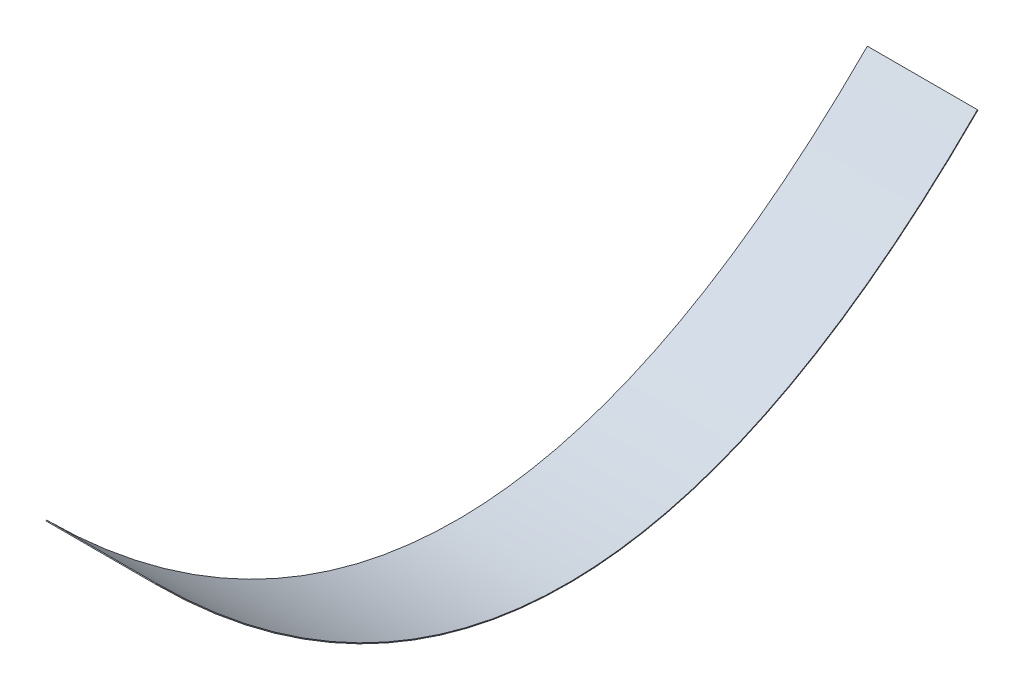
ISO-10303-21;
HEADER;
FILE_DESCRIPTION(('STEP AP214'),'2;1');
FILE_NAME('part.step','',(''),(''),'','','');
FILE_SCHEMA(('AUTOMOTIVE_DESIGN { 1 0 10303 214 1 1 1 1 }'));
ENDSEC;
DATA;
#1=APPLICATION_CONTEXT('core data for automotive mechanical design processes');
#2=APPLICATION_PROTOCOL_DEFINITION('international standard','automotive_design',2000,#1);
#3=PRODUCT_CONTEXT('',#1,'mechanical');
#4=PRODUCT('Part','Part','',(#3));
#5=PRODUCT_RELATED_PRODUCT_CATEGORY('part','',(#4));
#6=PRODUCT_DEFINITION_FORMATION('','',#4);
#7=PRODUCT_DEFINITION_CONTEXT('part definition',#1,'design');
#8=PRODUCT_DEFINITION('design','',#6,#7);
#9=PRODUCT_DEFINITION_SHAPE('','',#8);
#10=(LENGTH_UNIT() NAMED_UNIT(*) SI_UNIT(.MILLI.,.METRE.));
#11=(NAMED_UNIT(*) PLANE_ANGLE_UNIT() SI_UNIT($,.RADIAN.));
#12=(NAMED_UNIT(*) SI_UNIT($,.STERADIAN.) SOLID_ANGLE_UNIT());
#13=UNCERTAINTY_MEASURE_WITH_UNIT(LENGTH_MEASURE(1.E-05),#10,'distance_accuracy_value','');
#14=(GEOMETRIC_REPRESENTATION_CONTEXT(3) GLOBAL_UNCERTAINTY_ASSIGNED_CONTEXT((#13)) GLOBAL_UNIT_ASSIGNED_CONTEXT((#10,
#11,#12)) REPRESENTATION_CONTEXT('',''));
#15=CARTESIAN_POINT('',(0.,0.,0.));
#16=DIRECTION('',(0.,0.,1.));
#17=DIRECTION('',(1.,0.,0.));
#18=AXIS2_PLACEMENT_3D('',#15,#16,#17);
#19=CARTESIAN_POINT('',(355.6,586.847130222272,-1325.35391397918));
#20=CARTESIAN_POINT('',(355.6,476.326132373149,-1214.83291806103));
#21=CARTESIAN_POINT('',(355.6,379.634611527581,-1104.32592885717));
#22=CARTESIAN_POINT('',(355.6,213.903421546227,-883.351011787333));
#23=CARTESIAN_POINT('',(355.6,144.863862614837,-772.883427474339));
#24=CARTESIAN_POINT('',(355.6,34.4194856223334,-551.994675448119));
#25=CARTESIAN_POINT('',(355.6,-6.98568006476537,-441.574000959311));
#26=CARTESIAN_POINT('',(355.6,-62.1869629428457,-220.768870498862));
#27=CARTESIAN_POINT('',(355.6,-75.9839209717906,-110.384143639576));
#28=CARTESIAN_POINT('',(355.6,-75.9839210009218,110.384189664636));
#29=CARTESIAN_POINT('',(355.6,-62.186963001041,220.76891700895));
#30=CARTESIAN_POINT('',(355.6,-6.98568017886781,441.57404940776));
#31=CARTESIAN_POINT('',(355.6,34.4194854813689,551.994725349752));
#32=CARTESIAN_POINT('',(355.6,144.863862421881,772.883481247837));
#33=CARTESIAN_POINT('',(355.6,213.903421328107,883.351067979498));
#34=CARTESIAN_POINT('',(355.6,379.634611259261,1104.3259908513));
#35=CARTESIAN_POINT('',(355.6,476.326132079796,1214.83298343851));
#36=CARTESIAN_POINT('',(355.6,586.847129903645,1325.35398322249));
#37=B_SPLINE_CURVE_WITH_KNOTS('',3,(#19,#20,#21,#22,#23,#24,#25,#26,#27,#28,#29,#30,#31,#32,#33,
#34,#35,#36),.UNSPECIFIED.,.F.,.F.,(4,2,2,2,2,2,2,2,4),(0.,0.125,0.25,0.375,0.5,0.625,0.75,
0.875,1.),.UNSPECIFIED.);
#38=DIRECTION('',(-1.,0.,0.));
#39=VECTOR('',#38,1.);
#40=SURFACE_OF_LINEAR_EXTRUSION('',#37,#39);
#41=CARTESIAN_POINT('',(0.,586.847130222272,-1325.35391397918));
#42=CARTESIAN_POINT('',(0.,476.326132373149,-1214.83291806103));
#43=CARTESIAN_POINT('',(0.,379.634611527581,-1104.32592885717));
#44=CARTESIAN_POINT('',(0.,213.903421546227,-883.351011787333));
#45=CARTESIAN_POINT('',(0.,144.863862614837,-772.883427474339));
#46=CARTESIAN_POINT('',(0.,34.4194856223334,-551.994675448119));
#47=CARTESIAN_POINT('',(0.,-6.98568006476537,-441.574000959311));
#48=CARTESIAN_POINT('',(0.,-62.1869629428457,-220.768870498862));
#49=CARTESIAN_POINT('',(0.,-75.9839209717906,-110.384143639576));
#50=CARTESIAN_POINT('',(0.,-75.9839210009218,110.384189664636));
#51=CARTESIAN_POINT('',(0.,-62.186963001041,220.76891700895));
#52=CARTESIAN_POINT('',(0.,-6.98568017886781,441.57404940776));
#53=CARTESIAN_POINT('',(0.,34.4194854813689,551.994725349752));
#54=CARTESIAN_POINT('',(0.,144.863862421881,772.883481247837));
#55=CARTESIAN_POINT('',(0.,213.903421328107,883.351067979498));
#56=CARTESIAN_POINT('',(0.,379.634611259261,1104.3259908513));
#57=CARTESIAN_POINT('',(0.,476.326132079796,1214.83298343851));
#58=CARTESIAN_POINT('',(0.,586.847129903645,1325.35398322249));
#59=B_SPLINE_CURVE_WITH_KNOTS('',3,(#41,#42,#43,#44,#45,#46,#47,#48,#49,#50,#51,#52,#53,#54,#55,
#56,#57,#58),.UNSPECIFIED.,.F.,.F.,(4,2,2,2,2,2,2,2,4),(0.,0.125,0.25,0.375,0.5,0.625,0.75,
0.875,1.),.UNSPECIFIED.);
#60=CARTESIAN_POINT('',(0.,586.847130222272,-1325.35391397918));
#61=VERTEX_POINT('',#60);
#62=CARTESIAN_POINT('',(0.,586.847129903645,1325.35398322249));
#63=VERTEX_POINT('',#62);
#64=EDGE_CURVE('E112',#61,#63,#59,.T.);
#65=ORIENTED_EDGE('',*,*,#64,.T.);
#66=DIRECTION('',(-1.,0.,0.));
#67=VECTOR('',#66,1.);
#68=CARTESIAN_POINT('',(355.6,586.847129903645,1325.35398322249));
#69=LINE('',#68,#67);
#70=CARTESIAN_POINT('',(355.6,586.847129903645,1325.35398322249));
#71=VERTEX_POINT('',#70);
#72=EDGE_CURVE('E11',#71,#63,#69,.T.);
#73=ORIENTED_EDGE('',*,*,#72,.F.);
#74=CARTESIAN_POINT('',(355.6,586.847130222272,-1325.35391397918));
#75=VERTEX_POINT('',#74);
#76=EDGE_CURVE('E73',#75,#71,#37,.T.);
#77=ORIENTED_EDGE('',*,*,#76,.F.);
#78=DIRECTION('',(-1.,0.,0.));
#79=VECTOR('',#78,1.);
#80=CARTESIAN_POINT('',(355.6,586.847130222272,-1325.35391397918));
#81=LINE('',#80,#79);
#82=EDGE_CURVE('E49',#75,#61,#81,.T.);
#83=ORIENTED_EDGE('',*,*,#82,.T.);
#84=EDGE_LOOP('',(#65,#73,#77,#83));
#85=FACE_BOUND('',#84,.T.);
#86=ADVANCED_FACE('F32',(#85),#40,.F.);
#87=CARTESIAN_POINT('',(355.6,585.051078663481,1327.15003443081));
#88=DIRECTION('',(0.,0.707106774918268,0.707106787454827));
#89=DIRECTION('',(0.,-0.707106787454827,0.707106774918268));
#90=AXIS2_PLACEMENT_3D('',#87,#88,#89);
#91=PLANE('',#90);
#92=DIRECTION('',(0.,0.707106787454827,-0.707106774918268));
#93=VECTOR('',#92,1.);
#94=CARTESIAN_POINT('',(0.,585.051078663481,1327.15003443081));
#95=LINE('',#94,#93);
#96=CARTESIAN_POINT('',(0.,585.051078663481,1327.15003443081));
#97=VERTEX_POINT('',#96);
#98=EDGE_CURVE('E82',#97,#63,#95,.T.);
#99=ORIENTED_EDGE('',*,*,#98,.F.);
#100=DIRECTION('',(-1.,0.,0.));
#101=VECTOR('',#100,1.);
#102=CARTESIAN_POINT('',(355.6,585.051078663481,1327.15003443081));
#103=LINE('',#102,#101);
#104=CARTESIAN_POINT('',(355.6,585.051078663481,1327.15003443081));
#105=VERTEX_POINT('',#104);
#106=EDGE_CURVE('E41',#105,#97,#103,.T.);
#107=ORIENTED_EDGE('',*,*,#106,.F.);
#108=DIRECTION('',(0.,0.707106787454827,-0.707106774918268));
#109=VECTOR('',#108,1.);
#110=CARTESIAN_POINT('',(355.6,585.051078663481,1327.15003443081));
#111=LINE('',#110,#109);
#112=EDGE_CURVE('E80',#105,#71,#111,.T.);
#113=ORIENTED_EDGE('',*,*,#112,.T.);
#114=ORIENTED_EDGE('',*,*,#72,.T.);
#115=EDGE_LOOP('',(#99,#107,#113,#114));
#116=FACE_BOUND('',#115,.T.);
#117=ADVANCED_FACE('F79',(#116),#91,.T.);
#118=CARTESIAN_POINT('',(355.6,999921.476979144,-51519.8815967177));
#119=CARTESIAN_POINT('',(355.6,-1000078.52392099,-0.0174715061689312));
#120=CARTESIAN_POINT('',(355.6,999921.475178883,51519.91653973));
#121=B_SPLINE_CURVE_WITH_KNOTS('',2,(#118,#119,#120),.UNSPECIFIED.,.F.,.F.,(3,3),(0.,1.),.UNSPECIFIED.);
#122=DIRECTION('',(-1.,0.,0.));
#123=VECTOR('',#122,1.);
#124=SURFACE_OF_LINEAR_EXTRUSION('',#121,#123);
#125=CARTESIAN_POINT('',(0.,999921.476979144,-51519.8815967177));
#126=CARTESIAN_POINT('',(0.,-1000078.52392099,-0.0174715061689312));
#127=CARTESIAN_POINT('',(0.,999921.475178883,51519.91653973));
#128=B_SPLINE_CURVE_WITH_KNOTS('',2,(#125,#126,#127),.UNSPECIFIED.,.F.,.F.,(3,3),(0.,1.),.UNSPECIFIED.);
#129=CARTESIAN_POINT('',(0.,585.051079013738,-1327.14996521907));
#130=VERTEX_POINT('',#129);
#131=EDGE_CURVE('E116',#130,#97,#128,.T.);
#132=ORIENTED_EDGE('',*,*,#131,.F.);
#133=DIRECTION('',(-1.,0.,0.));
#134=VECTOR('',#133,1.);
#135=CARTESIAN_POINT('',(355.6,585.051079013738,-1327.14996521907));
#136=LINE('',#135,#134);
#137=CARTESIAN_POINT('',(355.6,585.051079013738,-1327.14996521907));
#138=VERTEX_POINT('',#137);
#139=EDGE_CURVE('E62',#138,#130,#136,.T.);
#140=ORIENTED_EDGE('',*,*,#139,.F.);
#141=EDGE_CURVE('E88',#138,#105,#121,.T.);
#142=ORIENTED_EDGE('',*,*,#141,.T.);
#143=ORIENTED_EDGE('',*,*,#106,.T.);
#144=EDGE_LOOP('',(#132,#140,#142,#143));
#145=FACE_BOUND('',#144,.T.);
#146=ADVANCED_FACE('F90',(#145),#124,.T.);
#147=CARTESIAN_POINT('',(355.6,586.847130222272,-1325.35391397918));
#148=DIRECTION('',(0.,0.707106787359497,-0.707106775013598));
#149=DIRECTION('',(0.,0.707106775013598,0.707106787359497));
#150=AXIS2_PLACEMENT_3D('',#147,#148,#149);
#151=PLANE('',#150);
#152=DIRECTION('',(0.,-0.707106775013598,-0.707106787359497));
#153=VECTOR('',#152,1.);
#154=CARTESIAN_POINT('',(0.,586.847130222272,-1325.35391397918));
#155=LINE('',#154,#153);
#156=EDGE_CURVE('E118',#61,#130,#155,.T.);
#157=ORIENTED_EDGE('',*,*,#156,.F.);
#158=ORIENTED_EDGE('',*,*,#82,.F.);
#159=DIRECTION('',(0.,-0.707106775013598,-0.707106787359497));
#160=VECTOR('',#159,1.);
#161=CARTESIAN_POINT('',(355.6,586.847130222272,-1325.35391397918));
#162=LINE('',#161,#160);
#163=EDGE_CURVE('E91',#75,#138,#162,.T.);
#164=ORIENTED_EDGE('',*,*,#163,.T.);
#165=ORIENTED_EDGE('',*,*,#139,.T.);
#166=EDGE_LOOP('',(#157,#158,#164,#165));
#167=FACE_BOUND('',#166,.T.);
#168=ADVANCED_FACE('F104',(#167),#151,.T.);
#169=CARTESIAN_POINT('',(355.6,-75.9839209863562,2.30125301948296E-05));
#170=DIRECTION('',(1.,0.,0.));
#171=DIRECTION('',(0.,0.,-1.));
#172=AXIS2_PLACEMENT_3D('',#169,#170,#171);
#173=PLANE('',#172);
#174=ORIENTED_EDGE('',*,*,#76,.T.);
#175=ORIENTED_EDGE('',*,*,#112,.F.);
#176=ORIENTED_EDGE('',*,*,#141,.F.);
#177=ORIENTED_EDGE('',*,*,#163,.F.);
#178=EDGE_LOOP('',(#174,#175,#176,#177));
#179=FACE_BOUND('',#178,.T.);
#180=ADVANCED_FACE('F87',(#179),#173,.T.);
#181=CARTESIAN_POINT('',(0.,-75.9839209863562,2.30125301948296E-05));
#182=DIRECTION('',(1.,0.,0.));
#183=DIRECTION('',(0.,0.,-1.));
#184=AXIS2_PLACEMENT_3D('',#181,#182,#183);
#185=PLANE('',#184);
#186=ORIENTED_EDGE('',*,*,#64,.F.);
#187=ORIENTED_EDGE('',*,*,#156,.T.);
#188=ORIENTED_EDGE('',*,*,#131,.T.);
#189=ORIENTED_EDGE('',*,*,#98,.T.);
#190=EDGE_LOOP('',(#186,#187,#188,#189));
#191=FACE_BOUND('',#190,.T.);
#192=ADVANCED_FACE('F115',(#191),#185,.F.);
#193=CLOSED_SHELL('',(#86,#117,#146,#168,#180,#192));
#194=MANIFOLD_SOLID_BREP('B2',#193);
#195=ADVANCED_BREP_SHAPE_REPRESENTATION('',(#18,#194),#14);
#196=SHAPE_DEFINITION_REPRESENTATION(#9,#195);
ENDSEC;
END-ISO-10303-21;
